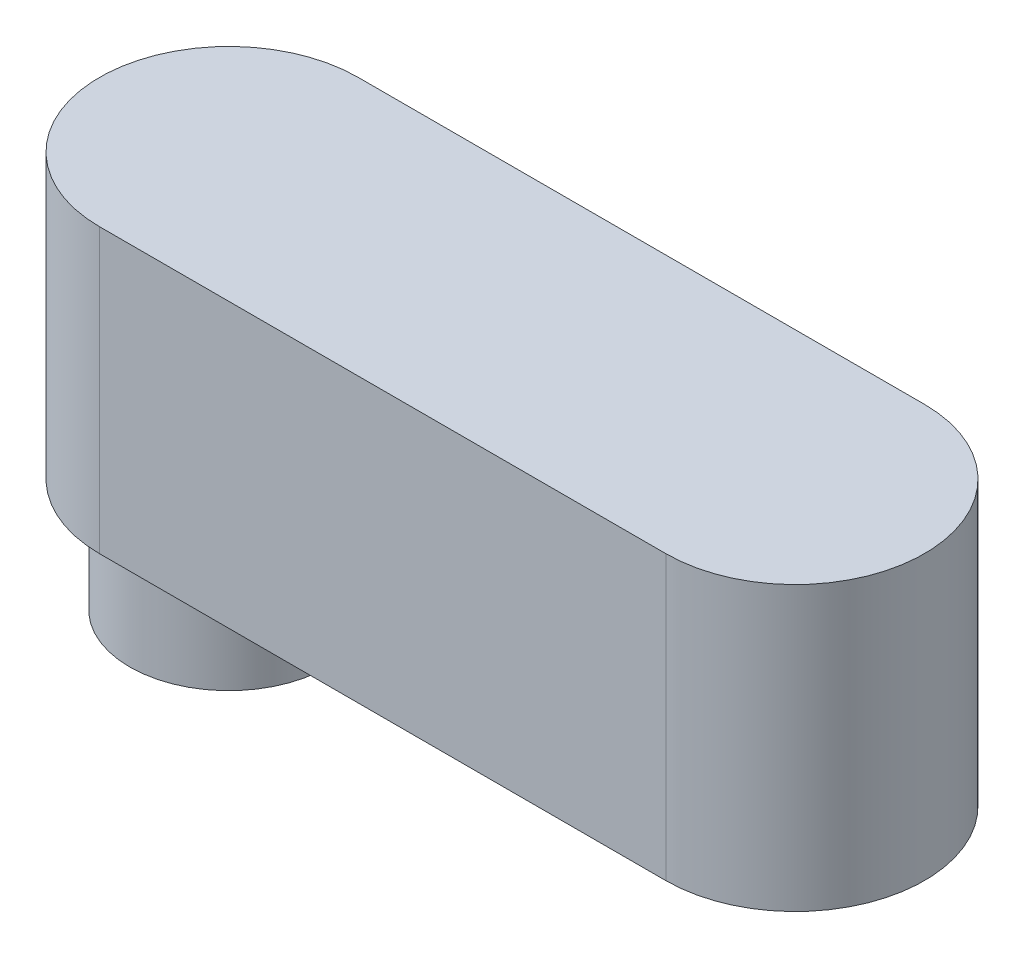
ISO-10303-21;
HEADER;
FILE_DESCRIPTION(('STEP AP214'),'2;1');
FILE_NAME('part.step','',(''),(''),'','','');
FILE_SCHEMA(('AUTOMOTIVE_DESIGN { 1 0 10303 214 1 1 1 1 }'));
ENDSEC;
DATA;
#1=APPLICATION_CONTEXT('core data for automotive mechanical design processes');
#2=APPLICATION_PROTOCOL_DEFINITION('international standard','automotive_design',2000,#1);
#3=PRODUCT_CONTEXT('',#1,'mechanical');
#4=PRODUCT('Part','Part','',(#3));
#5=PRODUCT_RELATED_PRODUCT_CATEGORY('part','',(#4));
#6=PRODUCT_DEFINITION_FORMATION('','',#4);
#7=PRODUCT_DEFINITION_CONTEXT('part definition',#1,'design');
#8=PRODUCT_DEFINITION('design','',#6,#7);
#9=PRODUCT_DEFINITION_SHAPE('','',#8);
#10=(LENGTH_UNIT() NAMED_UNIT(*) SI_UNIT(.MILLI.,.METRE.));
#11=(NAMED_UNIT(*) PLANE_ANGLE_UNIT() SI_UNIT($,.RADIAN.));
#12=(NAMED_UNIT(*) SI_UNIT($,.STERADIAN.) SOLID_ANGLE_UNIT());
#13=UNCERTAINTY_MEASURE_WITH_UNIT(LENGTH_MEASURE(1.E-05),#10,'distance_accuracy_value','');
#14=(GEOMETRIC_REPRESENTATION_CONTEXT(3) GLOBAL_UNCERTAINTY_ASSIGNED_CONTEXT((#13)) GLOBAL_UNIT_ASSIGNED_CONTEXT((#10,
#11,#12)) REPRESENTATION_CONTEXT('',''));
#15=CARTESIAN_POINT('',(0.,0.,0.));
#16=DIRECTION('',(0.,0.,1.));
#17=DIRECTION('',(1.,0.,0.));
#18=AXIS2_PLACEMENT_3D('',#15,#16,#17);
#19=CARTESIAN_POINT('',(0.,10.,4.56666666666667));
#20=DIRECTION('',(0.,-1.,0.));
#21=DIRECTION('',(0.,0.,-1.));
#22=AXIS2_PLACEMENT_3D('',#19,#20,#21);
#23=CYLINDRICAL_SURFACE('',#22,4.56666666666667);
#24=CARTESIAN_POINT('',(0.,0.,4.56666666666667));
#25=DIRECTION('',(0.,1.,0.));
#26=DIRECTION('',(0.,0.,1.));
#27=AXIS2_PLACEMENT_3D('',#24,#25,#26);
#28=CIRCLE('',#27,4.56666666666667);
#29=CARTESIAN_POINT('',(0.,0.,0.));
#30=VERTEX_POINT('',#29);
#31=CARTESIAN_POINT('',(0.,0.,9.13333333333333));
#32=VERTEX_POINT('',#31);
#33=EDGE_CURVE('E96',#30,#32,#28,.T.);
#34=ORIENTED_EDGE('',*,*,#33,.T.);
#35=DIRECTION('',(0.,-1.,0.));
#36=VECTOR('',#35,1.);
#37=CARTESIAN_POINT('',(0.,10.,9.13333333333333));
#38=LINE('',#37,#36);
#39=CARTESIAN_POINT('',(0.,10.,9.13333333333333));
#40=VERTEX_POINT('',#39);
#41=EDGE_CURVE('E11',#40,#32,#38,.T.);
#42=ORIENTED_EDGE('',*,*,#41,.F.);
#43=CARTESIAN_POINT('',(0.,10.,4.56666666666667));
#44=DIRECTION('',(0.,1.,0.));
#45=DIRECTION('',(0.,0.,1.));
#46=AXIS2_PLACEMENT_3D('',#43,#44,#45);
#47=CIRCLE('',#46,4.56666666666667);
#48=CARTESIAN_POINT('',(0.,10.,0.));
#49=VERTEX_POINT('',#48);
#50=EDGE_CURVE('E84',#49,#40,#47,.T.);
#51=ORIENTED_EDGE('',*,*,#50,.F.);
#52=DIRECTION('',(0.,-1.,0.));
#53=VECTOR('',#52,1.);
#54=CARTESIAN_POINT('',(0.,10.,0.));
#55=LINE('',#54,#53);
#56=EDGE_CURVE('E92',#49,#30,#55,.T.);
#57=ORIENTED_EDGE('',*,*,#56,.T.);
#58=EDGE_LOOP('',(#34,#42,#51,#57));
#59=FACE_BOUND('',#58,.T.);
#60=ADVANCED_FACE('F33',(#59),#23,.T.);
#61=CARTESIAN_POINT('',(0.,10.,9.13333333333333));
#62=DIRECTION('',(0.,0.,-1.));
#63=DIRECTION('',(-1.,0.,0.));
#64=AXIS2_PLACEMENT_3D('',#61,#62,#63);
#65=PLANE('',#64);
#66=DIRECTION('',(1.,0.,0.));
#67=VECTOR('',#66,1.);
#68=CARTESIAN_POINT('',(0.,0.,9.13333333333333));
#69=LINE('',#68,#67);
#70=CARTESIAN_POINT('',(20.,0.,9.13333333333333));
#71=VERTEX_POINT('',#70);
#72=EDGE_CURVE('E88',#32,#71,#69,.T.);
#73=ORIENTED_EDGE('',*,*,#72,.T.);
#74=DIRECTION('',(0.,-1.,0.));
#75=VECTOR('',#74,1.);
#76=CARTESIAN_POINT('',(20.,10.,9.13333333333333));
#77=LINE('',#76,#75);
#78=CARTESIAN_POINT('',(20.,10.,9.13333333333333));
#79=VERTEX_POINT('',#78);
#80=EDGE_CURVE('E41',#79,#71,#77,.T.);
#81=ORIENTED_EDGE('',*,*,#80,.F.);
#82=DIRECTION('',(1.,0.,0.));
#83=VECTOR('',#82,1.);
#84=CARTESIAN_POINT('',(0.,10.,9.13333333333333));
#85=LINE('',#84,#83);
#86=EDGE_CURVE('E79',#40,#79,#85,.T.);
#87=ORIENTED_EDGE('',*,*,#86,.F.);
#88=ORIENTED_EDGE('',*,*,#41,.T.);
#89=EDGE_LOOP('',(#73,#81,#87,#88));
#90=FACE_BOUND('',#89,.T.);
#91=ADVANCED_FACE('F87',(#90),#65,.F.);
#92=CARTESIAN_POINT('',(20.,10.,4.56666666666667));
#93=DIRECTION('',(0.,-1.,0.));
#94=DIRECTION('',(0.,0.,-1.));
#95=AXIS2_PLACEMENT_3D('',#92,#93,#94);
#96=CYLINDRICAL_SURFACE('',#95,4.56666666666667);
#97=CARTESIAN_POINT('',(20.,0.,4.56666666666667));
#98=DIRECTION('',(0.,1.,0.));
#99=DIRECTION('',(0.,0.,-1.));
#100=AXIS2_PLACEMENT_3D('',#97,#98,#99);
#101=CIRCLE('',#100,4.56666666666667);
#102=CARTESIAN_POINT('',(20.,0.,0.));
#103=VERTEX_POINT('',#102);
#104=EDGE_CURVE('E66',#71,#103,#101,.T.);
#105=ORIENTED_EDGE('',*,*,#104,.T.);
#106=DIRECTION('',(0.,-1.,0.));
#107=VECTOR('',#106,1.);
#108=CARTESIAN_POINT('',(20.,10.,0.));
#109=LINE('',#108,#107);
#110=CARTESIAN_POINT('',(20.,10.,0.));
#111=VERTEX_POINT('',#110);
#112=EDGE_CURVE('E89',#111,#103,#109,.T.);
#113=ORIENTED_EDGE('',*,*,#112,.F.);
#114=CARTESIAN_POINT('',(20.,10.,4.56666666666667));
#115=DIRECTION('',(0.,1.,0.));
#116=DIRECTION('',(0.,0.,-1.));
#117=AXIS2_PLACEMENT_3D('',#114,#115,#116);
#118=CIRCLE('',#117,4.56666666666667);
#119=EDGE_CURVE('E82',#79,#111,#118,.T.);
#120=ORIENTED_EDGE('',*,*,#119,.F.);
#121=ORIENTED_EDGE('',*,*,#80,.T.);
#122=EDGE_LOOP('',(#105,#113,#120,#121));
#123=FACE_BOUND('',#122,.T.);
#124=ADVANCED_FACE('F90',(#123),#96,.T.);
#125=CARTESIAN_POINT('',(0.,10.,0.));
#126=DIRECTION('',(0.,0.,1.));
#127=DIRECTION('',(1.,0.,0.));
#128=AXIS2_PLACEMENT_3D('',#125,#126,#127);
#129=PLANE('',#128);
#130=DIRECTION('',(-1.,0.,0.));
#131=VECTOR('',#130,1.);
#132=CARTESIAN_POINT('',(0.,0.,0.));
#133=LINE('',#132,#131);
#134=EDGE_CURVE('E72',#103,#30,#133,.T.);
#135=ORIENTED_EDGE('',*,*,#134,.T.);
#136=ORIENTED_EDGE('',*,*,#56,.F.);
#137=DIRECTION('',(-1.,0.,0.));
#138=VECTOR('',#137,1.);
#139=CARTESIAN_POINT('',(0.,10.,0.));
#140=LINE('',#139,#138);
#141=EDGE_CURVE('E49',#111,#49,#140,.T.);
#142=ORIENTED_EDGE('',*,*,#141,.F.);
#143=ORIENTED_EDGE('',*,*,#112,.T.);
#144=EDGE_LOOP('',(#135,#136,#142,#143));
#145=FACE_BOUND('',#144,.T.);
#146=ADVANCED_FACE('F104',(#145),#129,.F.);
#147=CARTESIAN_POINT('',(0.,10.,4.56666666666667));
#148=DIRECTION('',(0.,1.,0.));
#149=DIRECTION('',(0.,0.,1.));
#150=AXIS2_PLACEMENT_3D('',#147,#148,#149);
#151=PLANE('',#150);
#152=ORIENTED_EDGE('',*,*,#50,.T.);
#153=ORIENTED_EDGE('',*,*,#86,.T.);
#154=ORIENTED_EDGE('',*,*,#119,.T.);
#155=ORIENTED_EDGE('',*,*,#141,.T.);
#156=EDGE_LOOP('',(#152,#153,#154,#155));
#157=FACE_BOUND('',#156,.T.);
#158=ADVANCED_FACE('F80',(#157),#151,.T.);
#159=CARTESIAN_POINT('',(0.,0.,4.56666666666667));
#160=DIRECTION('',(0.,1.,0.));
#161=DIRECTION('',(0.,0.,1.));
#162=AXIS2_PLACEMENT_3D('',#159,#160,#161);
#163=PLANE('',#162);
#164=CARTESIAN_POINT('',(0.,0.,4.56666666666667));
#165=DIRECTION('',(0.,1.,0.));
#166=DIRECTION('',(0.,0.,1.));
#167=AXIS2_PLACEMENT_3D('',#164,#165,#166);
#168=CIRCLE('',#167,3.5);
#169=CARTESIAN_POINT('',(0.,0.,8.06666666666667));
#170=VERTEX_POINT('',#169);
#171=EDGE_CURVE('E110',#170,#170,#168,.T.);
#172=ORIENTED_EDGE('',*,*,#171,.T.);
#173=EDGE_LOOP('',(#172));
#174=FACE_BOUND('',#173,.T.);
#175=ORIENTED_EDGE('',*,*,#33,.F.);
#176=ORIENTED_EDGE('',*,*,#134,.F.);
#177=ORIENTED_EDGE('',*,*,#104,.F.);
#178=ORIENTED_EDGE('',*,*,#72,.F.);
#179=EDGE_LOOP('',(#175,#176,#177,#178));
#180=FACE_BOUND('',#179,.T.);
#181=ADVANCED_FACE('F107',(#174,#180),#163,.F.);
#182=CARTESIAN_POINT('',(0.,-4.,4.56666666666667));
#183=DIRECTION('',(0.,1.,0.));
#184=DIRECTION('',(0.,0.,1.));
#185=AXIS2_PLACEMENT_3D('',#182,#183,#184);
#186=CYLINDRICAL_SURFACE('',#185,3.5);
#187=CARTESIAN_POINT('',(0.,-4.,4.56666666666667));
#188=DIRECTION('',(0.,1.,0.));
#189=DIRECTION('',(0.,0.,1.));
#190=AXIS2_PLACEMENT_3D('',#187,#188,#189);
#191=CIRCLE('',#190,3.5);
#192=CARTESIAN_POINT('',(0.,-4.,8.06666666666667));
#193=VERTEX_POINT('',#192);
#194=EDGE_CURVE('E99',#193,#193,#191,.T.);
#195=ORIENTED_EDGE('',*,*,#194,.T.);
#196=EDGE_LOOP('',(#195));
#197=FACE_BOUND('',#196,.T.);
#198=ORIENTED_EDGE('',*,*,#171,.F.);
#199=EDGE_LOOP('',(#198));
#200=FACE_BOUND('',#199,.T.);
#201=ADVANCED_FACE('F116',(#197,#200),#186,.T.);
#202=CARTESIAN_POINT('',(0.,-4.,4.56666666666667));
#203=DIRECTION('',(0.,1.,0.));
#204=DIRECTION('',(0.,0.,1.));
#205=AXIS2_PLACEMENT_3D('',#202,#203,#204);
#206=PLANE('',#205);
#207=ORIENTED_EDGE('',*,*,#194,.F.);
#208=EDGE_LOOP('',(#207));
#209=FACE_BOUND('',#208,.T.);
#210=ADVANCED_FACE('F119',(#209),#206,.F.);
#211=CLOSED_SHELL('',(#60,#91,#124,#146,#158,#181,#201,#210));
#212=MANIFOLD_SOLID_BREP('B2',#211);
#213=ADVANCED_BREP_SHAPE_REPRESENTATION('',(#18,#212),#14);
#214=SHAPE_DEFINITION_REPRESENTATION(#9,#213);
ENDSEC;
END-ISO-10303-21;
